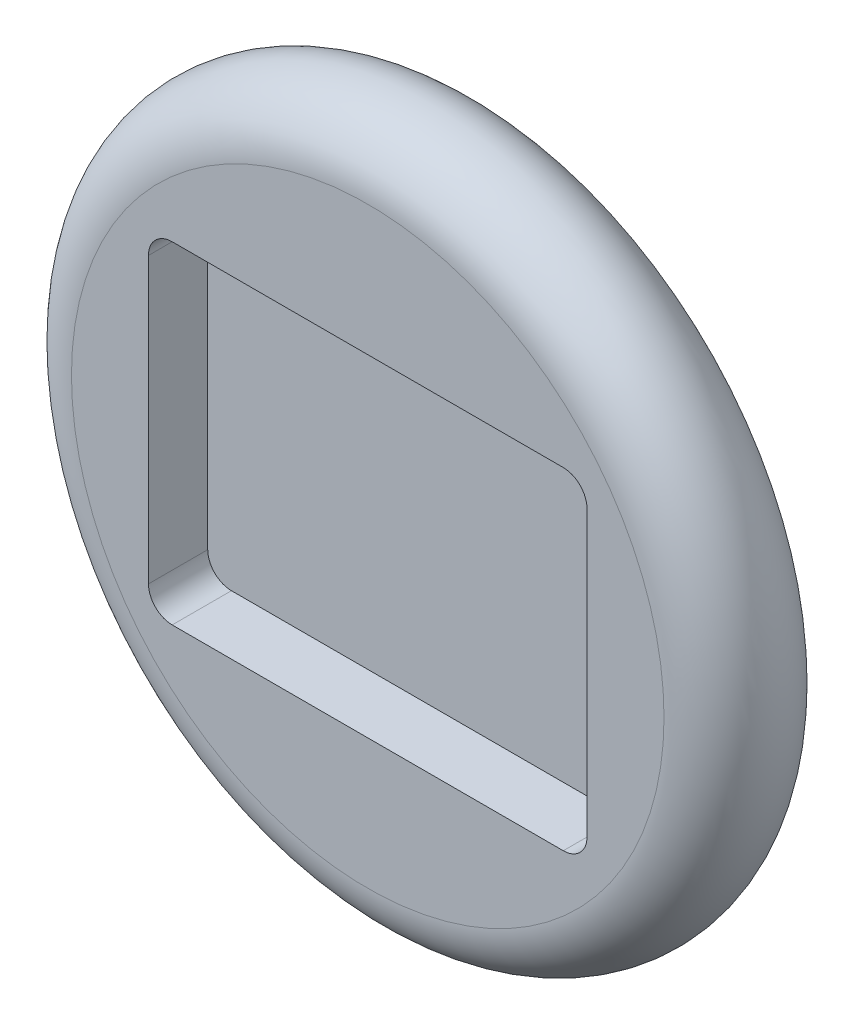
ISO-10303-21;
HEADER;
FILE_DESCRIPTION(('STEP AP214'),'2;1');
FILE_NAME('part.step','',(''),(''),'','','');
FILE_SCHEMA(('AUTOMOTIVE_DESIGN { 1 0 10303 214 1 1 1 1 }'));
ENDSEC;
DATA;
#1=APPLICATION_CONTEXT('core data for automotive mechanical design processes');
#2=APPLICATION_PROTOCOL_DEFINITION('international standard','automotive_design',2000,#1);
#3=PRODUCT_CONTEXT('',#1,'mechanical');
#4=PRODUCT('Part','Part','',(#3));
#5=PRODUCT_RELATED_PRODUCT_CATEGORY('part','',(#4));
#6=PRODUCT_DEFINITION_FORMATION('','',#4);
#7=PRODUCT_DEFINITION_CONTEXT('part definition',#1,'design');
#8=PRODUCT_DEFINITION('design','',#6,#7);
#9=PRODUCT_DEFINITION_SHAPE('','',#8);
#10=(LENGTH_UNIT() NAMED_UNIT(*) SI_UNIT(.MILLI.,.METRE.));
#11=(NAMED_UNIT(*) PLANE_ANGLE_UNIT() SI_UNIT($,.RADIAN.));
#12=(NAMED_UNIT(*) SI_UNIT($,.STERADIAN.) SOLID_ANGLE_UNIT());
#13=UNCERTAINTY_MEASURE_WITH_UNIT(LENGTH_MEASURE(1.E-05),#10,'distance_accuracy_value','');
#14=(GEOMETRIC_REPRESENTATION_CONTEXT(3) GLOBAL_UNCERTAINTY_ASSIGNED_CONTEXT((#13)) GLOBAL_UNIT_ASSIGNED_CONTEXT((#10,
#11,#12)) REPRESENTATION_CONTEXT('',''));
#15=CARTESIAN_POINT('',(0.,0.,0.));
#16=DIRECTION('',(0.,0.,1.));
#17=DIRECTION('',(1.,0.,0.));
#18=AXIS2_PLACEMENT_3D('',#15,#16,#17);
#19=CARTESIAN_POINT('',(0.,0.,-2.5));
#20=DIRECTION('',(0.,0.,1.));
#21=DIRECTION('',(1.,0.,0.));
#22=AXIS2_PLACEMENT_3D('',#19,#20,#21);
#23=TOROIDAL_SURFACE('',#22,25.,5.);
#24=CARTESIAN_POINT('',(0.,0.,-7.5));
#25=DIRECTION('',(0.,0.,1.));
#26=DIRECTION('',(1.,0.,0.));
#27=AXIS2_PLACEMENT_3D('',#24,#25,#26);
#28=CIRCLE('',#27,25.);
#29=CARTESIAN_POINT('',(25.,0.,-7.5));
#30=VERTEX_POINT('',#29);
#31=EDGE_CURVE('E11',#30,#30,#28,.T.);
#32=ORIENTED_EDGE('',*,*,#31,.T.);
#33=EDGE_LOOP('',(#32));
#34=FACE_BOUND('',#33,.T.);
#35=CARTESIAN_POINT('',(0.,0.,2.5));
#36=DIRECTION('',(0.,0.,1.));
#37=DIRECTION('',(1.,0.,0.));
#38=AXIS2_PLACEMENT_3D('',#35,#36,#37);
#39=CIRCLE('',#38,25.);
#40=CARTESIAN_POINT('',(25.,0.,2.5));
#41=VERTEX_POINT('',#40);
#42=EDGE_CURVE('E47',#41,#41,#39,.T.);
#43=ORIENTED_EDGE('',*,*,#42,.F.);
#44=EDGE_LOOP('',(#43));
#45=FACE_BOUND('',#44,.T.);
#46=ADVANCED_FACE('F39',(#34,#45),#23,.T.);
#47=CARTESIAN_POINT('',(0.,0.,-7.5));
#48=DIRECTION('',(0.,0.,-1.));
#49=DIRECTION('',(-1.,0.,0.));
#50=AXIS2_PLACEMENT_3D('',#47,#48,#49);
#51=PLANE('',#50);
#52=ORIENTED_EDGE('',*,*,#31,.F.);
#53=EDGE_LOOP('',(#52));
#54=FACE_BOUND('',#53,.T.);
#55=ADVANCED_FACE('F194',(#54),#51,.T.);
#56=CARTESIAN_POINT('',(0.,0.,2.5));
#57=DIRECTION('',(0.,0.,1.));
#58=DIRECTION('',(1.,0.,0.));
#59=AXIS2_PLACEMENT_3D('',#56,#57,#58);
#60=PLANE('',#59);
#61=CARTESIAN_POINT('',(16.5,12.,2.5));
#62=DIRECTION('',(0.,0.,1.));
#63=DIRECTION('',(1.,0.,0.));
#64=AXIS2_PLACEMENT_3D('',#61,#62,#63);
#65=CIRCLE('',#64,2.);
#66=CARTESIAN_POINT('',(18.5,12.,2.5));
#67=VERTEX_POINT('',#66);
#68=CARTESIAN_POINT('',(16.5,14.,2.5));
#69=VERTEX_POINT('',#68);
#70=EDGE_CURVE('E54',#67,#69,#65,.T.);
#71=ORIENTED_EDGE('',*,*,#70,.F.);
#72=DIRECTION('',(0.,1.,0.));
#73=VECTOR('',#72,1.);
#74=CARTESIAN_POINT('',(18.5,-12.,2.5));
#75=LINE('',#74,#73);
#76=CARTESIAN_POINT('',(18.5,-12.,2.5));
#77=VERTEX_POINT('',#76);
#78=EDGE_CURVE('E167',#77,#67,#75,.T.);
#79=ORIENTED_EDGE('',*,*,#78,.F.);
#80=CARTESIAN_POINT('',(16.5,-12.,2.5));
#81=DIRECTION('',(0.,0.,1.));
#82=DIRECTION('',(-1.,0.,0.));
#83=AXIS2_PLACEMENT_3D('',#80,#81,#82);
#84=CIRCLE('',#83,2.);
#85=CARTESIAN_POINT('',(16.5,-14.,2.5));
#86=VERTEX_POINT('',#85);
#87=EDGE_CURVE('E164',#86,#77,#84,.T.);
#88=ORIENTED_EDGE('',*,*,#87,.F.);
#89=DIRECTION('',(1.,0.,0.));
#90=VECTOR('',#89,1.);
#91=CARTESIAN_POINT('',(16.5,-14.,2.5));
#92=LINE('',#91,#90);
#93=CARTESIAN_POINT('',(-16.5,-14.,2.5));
#94=VERTEX_POINT('',#93);
#95=EDGE_CURVE('E114',#94,#86,#92,.T.);
#96=ORIENTED_EDGE('',*,*,#95,.F.);
#97=CARTESIAN_POINT('',(-16.5,-12.,2.5));
#98=DIRECTION('',(0.,0.,1.));
#99=DIRECTION('',(-1.,0.,0.));
#100=AXIS2_PLACEMENT_3D('',#97,#98,#99);
#101=CIRCLE('',#100,2.);
#102=CARTESIAN_POINT('',(-18.5,-12.,2.5));
#103=VERTEX_POINT('',#102);
#104=EDGE_CURVE('E158',#103,#94,#101,.T.);
#105=ORIENTED_EDGE('',*,*,#104,.F.);
#106=DIRECTION('',(0.,-1.,0.));
#107=VECTOR('',#106,1.);
#108=CARTESIAN_POINT('',(-18.5,-12.,2.5));
#109=LINE('',#108,#107);
#110=CARTESIAN_POINT('',(-18.5,12.,2.5));
#111=VERTEX_POINT('',#110);
#112=EDGE_CURVE('E154',#111,#103,#109,.T.);
#113=ORIENTED_EDGE('',*,*,#112,.F.);
#114=CARTESIAN_POINT('',(-16.5,12.,2.5));
#115=DIRECTION('',(0.,0.,1.));
#116=DIRECTION('',(-1.,0.,0.));
#117=AXIS2_PLACEMENT_3D('',#114,#115,#116);
#118=CIRCLE('',#117,2.);
#119=CARTESIAN_POINT('',(-16.5,14.,2.5));
#120=VERTEX_POINT('',#119);
#121=EDGE_CURVE('E150',#120,#111,#118,.T.);
#122=ORIENTED_EDGE('',*,*,#121,.F.);
#123=DIRECTION('',(-1.,0.,0.));
#124=VECTOR('',#123,1.);
#125=CARTESIAN_POINT('',(16.5,14.,2.5));
#126=LINE('',#125,#124);
#127=EDGE_CURVE('E146',#69,#120,#126,.T.);
#128=ORIENTED_EDGE('',*,*,#127,.F.);
#129=EDGE_LOOP('',(#71,#79,#88,#96,#105,#113,#122,#128));
#130=FACE_BOUND('',#129,.T.);
#131=ORIENTED_EDGE('',*,*,#42,.T.);
#132=EDGE_LOOP('',(#131));
#133=FACE_BOUND('',#132,.T.);
#134=ADVANCED_FACE('F191',(#130,#133),#60,.T.);
#135=CARTESIAN_POINT('',(16.5,12.,-2.5));
#136=DIRECTION('',(0.,0.,1.));
#137=DIRECTION('',(1.,0.,0.));
#138=AXIS2_PLACEMENT_3D('',#135,#136,#137);
#139=CYLINDRICAL_SURFACE('',#138,2.);
#140=ORIENTED_EDGE('',*,*,#70,.T.);
#141=DIRECTION('',(0.,0.,1.));
#142=VECTOR('',#141,1.);
#143=CARTESIAN_POINT('',(16.5,14.,-2.5));
#144=LINE('',#143,#142);
#145=CARTESIAN_POINT('',(16.5,14.,-2.5));
#146=VERTEX_POINT('',#145);
#147=EDGE_CURVE('E90',#146,#69,#144,.T.);
#148=ORIENTED_EDGE('',*,*,#147,.F.);
#149=CARTESIAN_POINT('',(16.5,12.,-2.5));
#150=DIRECTION('',(0.,0.,1.));
#151=DIRECTION('',(1.,0.,0.));
#152=AXIS2_PLACEMENT_3D('',#149,#150,#151);
#153=CIRCLE('',#152,2.);
#154=CARTESIAN_POINT('',(18.5,12.,-2.5));
#155=VERTEX_POINT('',#154);
#156=EDGE_CURVE('E170',#155,#146,#153,.T.);
#157=ORIENTED_EDGE('',*,*,#156,.F.);
#158=DIRECTION('',(0.,0.,1.));
#159=VECTOR('',#158,1.);
#160=CARTESIAN_POINT('',(18.5,12.,-2.5));
#161=LINE('',#160,#159);
#162=EDGE_CURVE('E62',#155,#67,#161,.T.);
#163=ORIENTED_EDGE('',*,*,#162,.T.);
#164=EDGE_LOOP('',(#140,#148,#157,#163));
#165=FACE_BOUND('',#164,.T.);
#166=ADVANCED_FACE('F204',(#165),#139,.F.);
#167=CARTESIAN_POINT('',(18.5,-12.,-2.5));
#168=DIRECTION('',(1.,0.,0.));
#169=DIRECTION('',(0.,0.,-1.));
#170=AXIS2_PLACEMENT_3D('',#167,#168,#169);
#171=PLANE('',#170);
#172=ORIENTED_EDGE('',*,*,#78,.T.);
#173=ORIENTED_EDGE('',*,*,#162,.F.);
#174=DIRECTION('',(0.,1.,0.));
#175=VECTOR('',#174,1.);
#176=CARTESIAN_POINT('',(18.5,-12.,-2.5));
#177=LINE('',#176,#175);
#178=CARTESIAN_POINT('',(18.5,-12.,-2.5));
#179=VERTEX_POINT('',#178);
#180=EDGE_CURVE('E128',#179,#155,#177,.T.);
#181=ORIENTED_EDGE('',*,*,#180,.F.);
#182=DIRECTION('',(0.,0.,1.));
#183=VECTOR('',#182,1.);
#184=CARTESIAN_POINT('',(18.5,-12.,-2.5));
#185=LINE('',#184,#183);
#186=EDGE_CURVE('E119',#179,#77,#185,.T.);
#187=ORIENTED_EDGE('',*,*,#186,.T.);
#188=EDGE_LOOP('',(#172,#173,#181,#187));
#189=FACE_BOUND('',#188,.T.);
#190=ADVANCED_FACE('F210',(#189),#171,.F.);
#191=CARTESIAN_POINT('',(16.5,-12.,-2.5));
#192=DIRECTION('',(0.,0.,1.));
#193=DIRECTION('',(1.,0.,0.));
#194=AXIS2_PLACEMENT_3D('',#191,#192,#193);
#195=CYLINDRICAL_SURFACE('',#194,2.);
#196=ORIENTED_EDGE('',*,*,#87,.T.);
#197=ORIENTED_EDGE('',*,*,#186,.F.);
#198=CARTESIAN_POINT('',(16.5,-12.,-2.5));
#199=DIRECTION('',(0.,0.,1.));
#200=DIRECTION('',(-1.,0.,0.));
#201=AXIS2_PLACEMENT_3D('',#198,#199,#200);
#202=CIRCLE('',#201,2.);
#203=CARTESIAN_POINT('',(16.5,-14.,-2.5));
#204=VERTEX_POINT('',#203);
#205=EDGE_CURVE('E123',#204,#179,#202,.T.);
#206=ORIENTED_EDGE('',*,*,#205,.F.);
#207=DIRECTION('',(0.,0.,1.));
#208=VECTOR('',#207,1.);
#209=CARTESIAN_POINT('',(16.5,-14.,-2.5));
#210=LINE('',#209,#208);
#211=EDGE_CURVE('E107',#204,#86,#210,.T.);
#212=ORIENTED_EDGE('',*,*,#211,.T.);
#213=EDGE_LOOP('',(#196,#197,#206,#212));
#214=FACE_BOUND('',#213,.T.);
#215=ADVANCED_FACE('F124',(#214),#195,.F.);
#216=CARTESIAN_POINT('',(16.5,-14.,-2.5));
#217=DIRECTION('',(0.,-1.,0.));
#218=DIRECTION('',(1.,0.,0.));
#219=AXIS2_PLACEMENT_3D('',#216,#217,#218);
#220=PLANE('',#219);
#221=ORIENTED_EDGE('',*,*,#95,.T.);
#222=ORIENTED_EDGE('',*,*,#211,.F.);
#223=DIRECTION('',(1.,0.,0.));
#224=VECTOR('',#223,1.);
#225=CARTESIAN_POINT('',(16.5,-14.,-2.5));
#226=LINE('',#225,#224);
#227=CARTESIAN_POINT('',(-16.5,-14.,-2.5));
#228=VERTEX_POINT('',#227);
#229=EDGE_CURVE('E111',#228,#204,#226,.T.);
#230=ORIENTED_EDGE('',*,*,#229,.F.);
#231=DIRECTION('',(0.,0.,1.));
#232=VECTOR('',#231,1.);
#233=CARTESIAN_POINT('',(-16.5,-14.,-2.5));
#234=LINE('',#233,#232);
#235=EDGE_CURVE('E120',#228,#94,#234,.T.);
#236=ORIENTED_EDGE('',*,*,#235,.T.);
#237=EDGE_LOOP('',(#221,#222,#230,#236));
#238=FACE_BOUND('',#237,.T.);
#239=ADVANCED_FACE('F109',(#238),#220,.F.);
#240=CARTESIAN_POINT('',(-16.5,-12.,-2.5));
#241=DIRECTION('',(0.,0.,1.));
#242=DIRECTION('',(1.,0.,0.));
#243=AXIS2_PLACEMENT_3D('',#240,#241,#242);
#244=CYLINDRICAL_SURFACE('',#243,2.);
#245=ORIENTED_EDGE('',*,*,#104,.T.);
#246=ORIENTED_EDGE('',*,*,#235,.F.);
#247=CARTESIAN_POINT('',(-16.5,-12.,-2.5));
#248=DIRECTION('',(0.,0.,1.));
#249=DIRECTION('',(-1.,0.,0.));
#250=AXIS2_PLACEMENT_3D('',#247,#248,#249);
#251=CIRCLE('',#250,2.);
#252=CARTESIAN_POINT('',(-18.5,-12.,-2.5));
#253=VERTEX_POINT('',#252);
#254=EDGE_CURVE('E134',#253,#228,#251,.T.);
#255=ORIENTED_EDGE('',*,*,#254,.F.);
#256=DIRECTION('',(0.,0.,1.));
#257=VECTOR('',#256,1.);
#258=CARTESIAN_POINT('',(-18.5,-12.,-2.5));
#259=LINE('',#258,#257);
#260=EDGE_CURVE('E177',#253,#103,#259,.T.);
#261=ORIENTED_EDGE('',*,*,#260,.T.);
#262=EDGE_LOOP('',(#245,#246,#255,#261));
#263=FACE_BOUND('',#262,.T.);
#264=ADVANCED_FACE('F222',(#263),#244,.F.);
#265=CARTESIAN_POINT('',(-18.5,-12.,-2.5));
#266=DIRECTION('',(-1.,0.,0.));
#267=DIRECTION('',(0.,-1.,0.));
#268=AXIS2_PLACEMENT_3D('',#265,#266,#267);
#269=PLANE('',#268);
#270=ORIENTED_EDGE('',*,*,#112,.T.);
#271=ORIENTED_EDGE('',*,*,#260,.F.);
#272=DIRECTION('',(0.,-1.,0.));
#273=VECTOR('',#272,1.);
#274=CARTESIAN_POINT('',(-18.5,-12.,-2.5));
#275=LINE('',#274,#273);
#276=CARTESIAN_POINT('',(-18.5,12.,-2.5));
#277=VERTEX_POINT('',#276);
#278=EDGE_CURVE('E138',#277,#253,#275,.T.);
#279=ORIENTED_EDGE('',*,*,#278,.F.);
#280=DIRECTION('',(0.,0.,1.));
#281=VECTOR('',#280,1.);
#282=CARTESIAN_POINT('',(-18.5,12.,-2.5));
#283=LINE('',#282,#281);
#284=EDGE_CURVE('E180',#277,#111,#283,.T.);
#285=ORIENTED_EDGE('',*,*,#284,.T.);
#286=EDGE_LOOP('',(#270,#271,#279,#285));
#287=FACE_BOUND('',#286,.T.);
#288=ADVANCED_FACE('F218',(#287),#269,.F.);
#289=CARTESIAN_POINT('',(-16.5,12.,-2.5));
#290=DIRECTION('',(0.,0.,1.));
#291=DIRECTION('',(1.,0.,0.));
#292=AXIS2_PLACEMENT_3D('',#289,#290,#291);
#293=CYLINDRICAL_SURFACE('',#292,2.);
#294=ORIENTED_EDGE('',*,*,#121,.T.);
#295=ORIENTED_EDGE('',*,*,#284,.F.);
#296=CARTESIAN_POINT('',(-16.5,12.,-2.5));
#297=DIRECTION('',(0.,0.,1.));
#298=DIRECTION('',(-1.,0.,0.));
#299=AXIS2_PLACEMENT_3D('',#296,#297,#298);
#300=CIRCLE('',#299,2.);
#301=CARTESIAN_POINT('',(-16.5,14.,-2.5));
#302=VERTEX_POINT('',#301);
#303=EDGE_CURVE('E311',#302,#277,#300,.T.);
#304=ORIENTED_EDGE('',*,*,#303,.F.);
#305=DIRECTION('',(0.,0.,1.));
#306=VECTOR('',#305,1.);
#307=CARTESIAN_POINT('',(-16.5,14.,-2.5));
#308=LINE('',#307,#306);
#309=EDGE_CURVE('E183',#302,#120,#308,.T.);
#310=ORIENTED_EDGE('',*,*,#309,.T.);
#311=EDGE_LOOP('',(#294,#295,#304,#310));
#312=FACE_BOUND('',#311,.T.);
#313=ADVANCED_FACE('F214',(#312),#293,.F.);
#314=CARTESIAN_POINT('',(16.5,14.,-2.5));
#315=DIRECTION('',(0.,1.,0.));
#316=DIRECTION('',(-1.,0.,0.));
#317=AXIS2_PLACEMENT_3D('',#314,#315,#316);
#318=PLANE('',#317);
#319=ORIENTED_EDGE('',*,*,#127,.T.);
#320=ORIENTED_EDGE('',*,*,#309,.F.);
#321=DIRECTION('',(-1.,0.,0.));
#322=VECTOR('',#321,1.);
#323=CARTESIAN_POINT('',(16.5,14.,-2.5));
#324=LINE('',#323,#322);
#325=EDGE_CURVE('E308',#146,#302,#324,.T.);
#326=ORIENTED_EDGE('',*,*,#325,.F.);
#327=ORIENTED_EDGE('',*,*,#147,.T.);
#328=EDGE_LOOP('',(#319,#320,#326,#327));
#329=FACE_BOUND('',#328,.T.);
#330=ADVANCED_FACE('F211',(#329),#318,.F.);
#331=CARTESIAN_POINT('',(16.5,12.,-2.5));
#332=DIRECTION('',(0.,0.,1.));
#333=DIRECTION('',(1.,0.,0.));
#334=AXIS2_PLACEMENT_3D('',#331,#332,#333);
#335=PLANE('',#334);
#336=ORIENTED_EDGE('',*,*,#156,.T.);
#337=ORIENTED_EDGE('',*,*,#325,.T.);
#338=ORIENTED_EDGE('',*,*,#303,.T.);
#339=ORIENTED_EDGE('',*,*,#278,.T.);
#340=ORIENTED_EDGE('',*,*,#254,.T.);
#341=ORIENTED_EDGE('',*,*,#229,.T.);
#342=ORIENTED_EDGE('',*,*,#205,.T.);
#343=ORIENTED_EDGE('',*,*,#180,.T.);
#344=EDGE_LOOP('',(#336,#337,#338,#339,#340,#341,#342,#343));
#345=FACE_BOUND('',#344,.T.);
#346=ADVANCED_FACE('F131',(#345),#335,.T.);
#347=CLOSED_SHELL('',(#46,#55,#134,#166,#190,#215,#239,#264,#288,#313,#330,#346));
#348=MANIFOLD_SOLID_BREP('B2',#347);
#349=ADVANCED_BREP_SHAPE_REPRESENTATION('',(#18,#348),#14);
#350=SHAPE_DEFINITION_REPRESENTATION(#9,#349);
ENDSEC;
END-ISO-10303-21;
